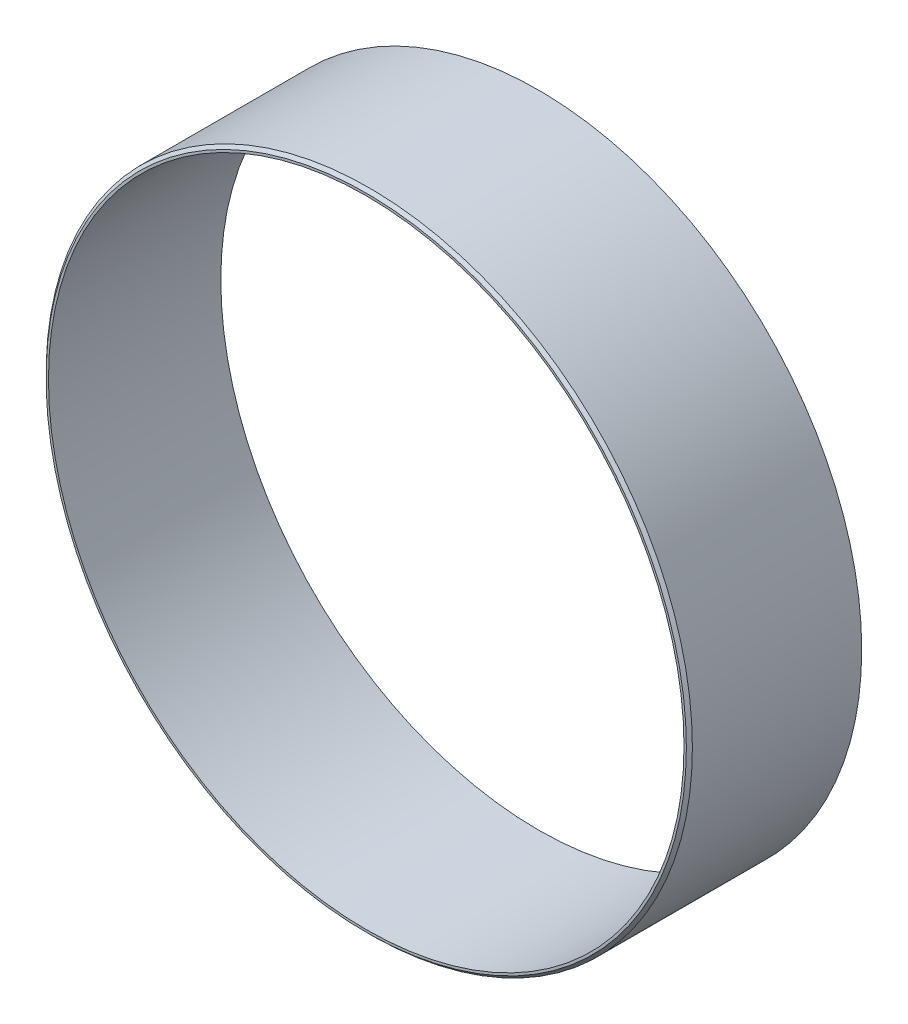
ISO-10303-21;
HEADER;
FILE_DESCRIPTION(('STEP AP214'),'2;1');
FILE_NAME('part.step','',(''),(''),'','','');
FILE_SCHEMA(('AUTOMOTIVE_DESIGN { 1 0 10303 214 1 1 1 1 }'));
ENDSEC;
DATA;
#1=APPLICATION_CONTEXT('core data for automotive mechanical design processes');
#2=APPLICATION_PROTOCOL_DEFINITION('international standard','automotive_design',2000,#1);
#3=PRODUCT_CONTEXT('',#1,'mechanical');
#4=PRODUCT('Part','Part','',(#3));
#5=PRODUCT_RELATED_PRODUCT_CATEGORY('part','',(#4));
#6=PRODUCT_DEFINITION_FORMATION('','',#4);
#7=PRODUCT_DEFINITION_CONTEXT('part definition',#1,'design');
#8=PRODUCT_DEFINITION('design','',#6,#7);
#9=PRODUCT_DEFINITION_SHAPE('','',#8);
#10=(LENGTH_UNIT() NAMED_UNIT(*) SI_UNIT(.MILLI.,.METRE.));
#11=(NAMED_UNIT(*) PLANE_ANGLE_UNIT() SI_UNIT($,.RADIAN.));
#12=(NAMED_UNIT(*) SI_UNIT($,.STERADIAN.) SOLID_ANGLE_UNIT());
#13=UNCERTAINTY_MEASURE_WITH_UNIT(LENGTH_MEASURE(1.E-05),#10,'distance_accuracy_value','');
#14=(GEOMETRIC_REPRESENTATION_CONTEXT(3) GLOBAL_UNCERTAINTY_ASSIGNED_CONTEXT((#13)) GLOBAL_UNIT_ASSIGNED_CONTEXT((#10,
#11,#12)) REPRESENTATION_CONTEXT('',''));
#15=CARTESIAN_POINT('',(0.,0.,0.));
#16=DIRECTION('',(0.,0.,1.));
#17=DIRECTION('',(1.,0.,0.));
#18=AXIS2_PLACEMENT_3D('',#15,#16,#17);
#19=CARTESIAN_POINT('',(0.,0.,40.));
#20=DIRECTION('',(0.,0.,1.));
#21=DIRECTION('',(1.,0.,0.));
#22=AXIS2_PLACEMENT_3D('',#19,#20,#21);
#23=PLANE('',#22);
#24=CARTESIAN_POINT('',(0.,0.,40.));
#25=DIRECTION('',(0.,0.,1.));
#26=DIRECTION('',(1.,0.,0.));
#27=AXIS2_PLACEMENT_3D('',#24,#25,#26);
#28=CIRCLE('',#27,74.3000000000001);
#29=CARTESIAN_POINT('',(74.3000000000001,0.,40.));
#30=VERTEX_POINT('',#29);
#31=EDGE_CURVE('E39',#30,#30,#28,.T.);
#32=ORIENTED_EDGE('',*,*,#31,.T.);
#33=EDGE_LOOP('',(#32));
#34=FACE_BOUND('',#33,.T.);
#35=CARTESIAN_POINT('',(0.,0.,40.));
#36=DIRECTION('',(0.,0.,1.));
#37=DIRECTION('',(1.,0.,0.));
#38=AXIS2_PLACEMENT_3D('',#35,#36,#37);
#39=CIRCLE('',#38,73.75);
#40=CARTESIAN_POINT('',(73.75,0.,40.));
#41=VERTEX_POINT('',#40);
#42=EDGE_CURVE('E47',#41,#41,#39,.T.);
#43=ORIENTED_EDGE('',*,*,#42,.F.);
#44=EDGE_LOOP('',(#43));
#45=FACE_BOUND('',#44,.T.);
#46=ADVANCED_FACE('F32',(#34,#45),#23,.T.);
#47=CARTESIAN_POINT('',(0.,0.,0.));
#48=DIRECTION('',(0.,0.,1.));
#49=DIRECTION('',(1.,0.,0.));
#50=AXIS2_PLACEMENT_3D('',#47,#48,#49);
#51=PLANE('',#50);
#52=CARTESIAN_POINT('',(0.,0.,0.));
#53=DIRECTION('',(0.,0.,1.));
#54=DIRECTION('',(1.,0.,0.));
#55=AXIS2_PLACEMENT_3D('',#52,#53,#54);
#56=CIRCLE('',#55,75.);
#57=CARTESIAN_POINT('',(75.,0.,0.));
#58=VERTEX_POINT('',#57);
#59=EDGE_CURVE('E43',#58,#58,#56,.T.);
#60=ORIENTED_EDGE('',*,*,#59,.F.);
#61=EDGE_LOOP('',(#60));
#62=FACE_BOUND('',#61,.T.);
#63=CARTESIAN_POINT('',(0.,0.,0.));
#64=DIRECTION('',(0.,0.,1.));
#65=DIRECTION('',(1.,0.,0.));
#66=AXIS2_PLACEMENT_3D('',#63,#64,#65);
#67=CIRCLE('',#66,73.75);
#68=CARTESIAN_POINT('',(73.75,0.,0.));
#69=VERTEX_POINT('',#68);
#70=EDGE_CURVE('E50',#69,#69,#67,.T.);
#71=ORIENTED_EDGE('',*,*,#70,.T.);
#72=EDGE_LOOP('',(#71));
#73=FACE_BOUND('',#72,.T.);
#74=ADVANCED_FACE('F60',(#62,#73),#51,.F.);
#75=CARTESIAN_POINT('',(0.,0.,40.));
#76=DIRECTION('',(0.,0.,-1.));
#77=DIRECTION('',(-1.,0.,0.));
#78=AXIS2_PLACEMENT_3D('',#75,#76,#77);
#79=CYLINDRICAL_SURFACE('',#78,75.);
#80=CARTESIAN_POINT('',(0.,0.,39.3));
#81=DIRECTION('',(0.,0.,1.));
#82=DIRECTION('',(1.,0.,0.));
#83=AXIS2_PLACEMENT_3D('',#80,#81,#82);
#84=CIRCLE('',#83,75.);
#85=CARTESIAN_POINT('',(75.,0.,39.3));
#86=VERTEX_POINT('',#85);
#87=EDGE_CURVE('E10',#86,#86,#84,.F.);
#88=ORIENTED_EDGE('',*,*,#87,.T.);
#89=EDGE_LOOP('',(#88));
#90=FACE_BOUND('',#89,.T.);
#91=ORIENTED_EDGE('',*,*,#59,.T.);
#92=EDGE_LOOP('',(#91));
#93=FACE_BOUND('',#92,.T.);
#94=ADVANCED_FACE('F67',(#90,#93),#79,.T.);
#95=CARTESIAN_POINT('',(0.,0.,40.));
#96=DIRECTION('',(0.,0.,-1.));
#97=DIRECTION('',(-1.,0.,0.));
#98=AXIS2_PLACEMENT_3D('',#95,#96,#97);
#99=CYLINDRICAL_SURFACE('',#98,73.75);
#100=ORIENTED_EDGE('',*,*,#42,.T.);
#101=EDGE_LOOP('',(#100));
#102=FACE_BOUND('',#101,.T.);
#103=ORIENTED_EDGE('',*,*,#70,.F.);
#104=EDGE_LOOP('',(#103));
#105=FACE_BOUND('',#104,.T.);
#106=ADVANCED_FACE('F56',(#102,#105),#99,.F.);
#107=CARTESIAN_POINT('',(0.,0.,40.));
#108=DIRECTION('',(0.,0.,-1.));
#109=DIRECTION('',(-1.,0.,0.));
#110=AXIS2_PLACEMENT_3D('',#107,#108,#109);
#111=CONICAL_SURFACE('',#110,74.3000000000001,0.785398163397438);
#112=ORIENTED_EDGE('',*,*,#87,.F.);
#113=EDGE_LOOP('',(#112));
#114=FACE_BOUND('',#113,.T.);
#115=ORIENTED_EDGE('',*,*,#31,.F.);
#116=EDGE_LOOP('',(#115));
#117=FACE_BOUND('',#116,.T.);
#118=ADVANCED_FACE('F34',(#114,#117),#111,.T.);
#119=CLOSED_SHELL('',(#46,#74,#94,#106,#118));
#120=MANIFOLD_SOLID_BREP('B2',#119);
#121=ADVANCED_BREP_SHAPE_REPRESENTATION('',(#18,#120),#14);
#122=SHAPE_DEFINITION_REPRESENTATION(#9,#121);
ENDSEC;
END-ISO-10303-21;
